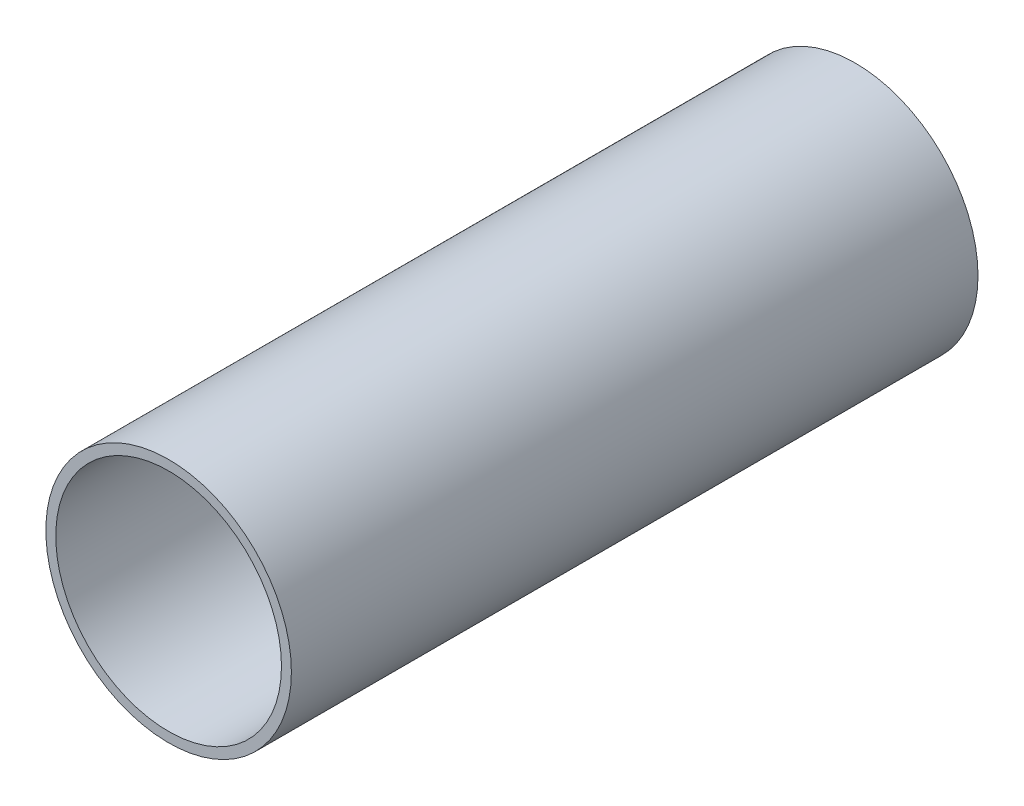
ISO-10303-21;
HEADER;
FILE_DESCRIPTION(('STEP AP214'),'2;1');
FILE_NAME('part.step','',(''),(''),'','','');
FILE_SCHEMA(('AUTOMOTIVE_DESIGN { 1 0 10303 214 1 1 1 1 }'));
ENDSEC;
DATA;
#1=APPLICATION_CONTEXT('core data for automotive mechanical design processes');
#2=APPLICATION_PROTOCOL_DEFINITION('international standard','automotive_design',2000,#1);
#3=PRODUCT_CONTEXT('',#1,'mechanical');
#4=PRODUCT('Part','Part','',(#3));
#5=PRODUCT_RELATED_PRODUCT_CATEGORY('part','',(#4));
#6=PRODUCT_DEFINITION_FORMATION('','',#4);
#7=PRODUCT_DEFINITION_CONTEXT('part definition',#1,'design');
#8=PRODUCT_DEFINITION('design','',#6,#7);
#9=PRODUCT_DEFINITION_SHAPE('','',#8);
#10=(LENGTH_UNIT() NAMED_UNIT(*) SI_UNIT(.MILLI.,.METRE.));
#11=(NAMED_UNIT(*) PLANE_ANGLE_UNIT() SI_UNIT($,.RADIAN.));
#12=(NAMED_UNIT(*) SI_UNIT($,.STERADIAN.) SOLID_ANGLE_UNIT());
#13=UNCERTAINTY_MEASURE_WITH_UNIT(LENGTH_MEASURE(1.E-05),#10,'distance_accuracy_value','');
#14=(GEOMETRIC_REPRESENTATION_CONTEXT(3) GLOBAL_UNCERTAINTY_ASSIGNED_CONTEXT((#13)) GLOBAL_UNIT_ASSIGNED_CONTEXT((#10,
#11,#12)) REPRESENTATION_CONTEXT('',''));
#15=CARTESIAN_POINT('',(0.,0.,0.));
#16=DIRECTION('',(0.,0.,1.));
#17=DIRECTION('',(1.,0.,0.));
#18=AXIS2_PLACEMENT_3D('',#15,#16,#17);
#19=CARTESIAN_POINT('',(0.,0.,609.6));
#20=DIRECTION('',(0.,0.,1.));
#21=DIRECTION('',(1.,0.,0.));
#22=AXIS2_PLACEMENT_3D('',#19,#20,#21);
#23=PLANE('',#22);
#24=CARTESIAN_POINT('',(0.,0.,609.6));
#25=DIRECTION('',(0.,0.,1.));
#26=DIRECTION('',(1.,0.,0.));
#27=AXIS2_PLACEMENT_3D('',#24,#25,#26);
#28=CIRCLE('',#27,109.);
#29=CARTESIAN_POINT('',(109.,0.,609.6));
#30=VERTEX_POINT('',#29);
#31=EDGE_CURVE('E12',#30,#30,#28,.T.);
#32=ORIENTED_EDGE('',*,*,#31,.T.);
#33=EDGE_LOOP('',(#32));
#34=FACE_BOUND('',#33,.T.);
#35=CARTESIAN_POINT('',(0.,0.,609.6));
#36=DIRECTION('',(0.,0.,1.));
#37=DIRECTION('',(1.,0.,0.));
#38=AXIS2_PLACEMENT_3D('',#35,#36,#37);
#39=CIRCLE('',#38,100.2);
#40=CARTESIAN_POINT('',(100.2,0.,609.6));
#41=VERTEX_POINT('',#40);
#42=EDGE_CURVE('E57',#41,#41,#39,.T.);
#43=ORIENTED_EDGE('',*,*,#42,.F.);
#44=EDGE_LOOP('',(#43));
#45=FACE_BOUND('',#44,.T.);
#46=ADVANCED_FACE('F46',(#34,#45),#23,.T.);
#47=CARTESIAN_POINT('',(0.,0.,0.));
#48=DIRECTION('',(0.,0.,1.));
#49=DIRECTION('',(1.,0.,0.));
#50=AXIS2_PLACEMENT_3D('',#47,#48,#49);
#51=PLANE('',#50);
#52=CARTESIAN_POINT('',(0.,0.,0.));
#53=DIRECTION('',(0.,0.,1.));
#54=DIRECTION('',(1.,0.,0.));
#55=AXIS2_PLACEMENT_3D('',#52,#53,#54);
#56=CIRCLE('',#55,109.);
#57=CARTESIAN_POINT('',(109.,0.,0.));
#58=VERTEX_POINT('',#57);
#59=EDGE_CURVE('E50',#58,#58,#56,.T.);
#60=ORIENTED_EDGE('',*,*,#59,.F.);
#61=EDGE_LOOP('',(#60));
#62=FACE_BOUND('',#61,.T.);
#63=CARTESIAN_POINT('',(0.,0.,0.));
#64=DIRECTION('',(0.,0.,1.));
#65=DIRECTION('',(1.,0.,0.));
#66=AXIS2_PLACEMENT_3D('',#63,#64,#65);
#67=CIRCLE('',#66,100.2);
#68=CARTESIAN_POINT('',(100.2,0.,0.));
#69=VERTEX_POINT('',#68);
#70=EDGE_CURVE('E59',#69,#69,#67,.T.);
#71=ORIENTED_EDGE('',*,*,#70,.T.);
#72=EDGE_LOOP('',(#71));
#73=FACE_BOUND('',#72,.T.);
#74=ADVANCED_FACE('F69',(#62,#73),#51,.F.);
#75=CARTESIAN_POINT('',(0.,0.,609.6));
#76=DIRECTION('',(0.,0.,-1.));
#77=DIRECTION('',(-1.,0.,0.));
#78=AXIS2_PLACEMENT_3D('',#75,#76,#77);
#79=CYLINDRICAL_SURFACE('',#78,109.);
#80=ORIENTED_EDGE('',*,*,#31,.F.);
#81=EDGE_LOOP('',(#80));
#82=FACE_BOUND('',#81,.T.);
#83=ORIENTED_EDGE('',*,*,#59,.T.);
#84=EDGE_LOOP('',(#83));
#85=FACE_BOUND('',#84,.T.);
#86=ADVANCED_FACE('F48',(#82,#85),#79,.T.);
#87=CARTESIAN_POINT('',(0.,0.,609.6));
#88=DIRECTION('',(0.,0.,-1.));
#89=DIRECTION('',(-1.,0.,0.));
#90=AXIS2_PLACEMENT_3D('',#87,#88,#89);
#91=CYLINDRICAL_SURFACE('',#90,100.2);
#92=ORIENTED_EDGE('',*,*,#42,.T.);
#93=EDGE_LOOP('',(#92));
#94=FACE_BOUND('',#93,.T.);
#95=ORIENTED_EDGE('',*,*,#70,.F.);
#96=EDGE_LOOP('',(#95));
#97=FACE_BOUND('',#96,.T.);
#98=ADVANCED_FACE('F65',(#94,#97),#91,.F.);
#99=CLOSED_SHELL('',(#46,#74,#86,#98));
#100=MANIFOLD_SOLID_BREP('B2',#99);
#101=ADVANCED_BREP_SHAPE_REPRESENTATION('',(#18,#100),#14);
#102=SHAPE_DEFINITION_REPRESENTATION(#9,#101);
ENDSEC;
END-ISO-10303-21;
